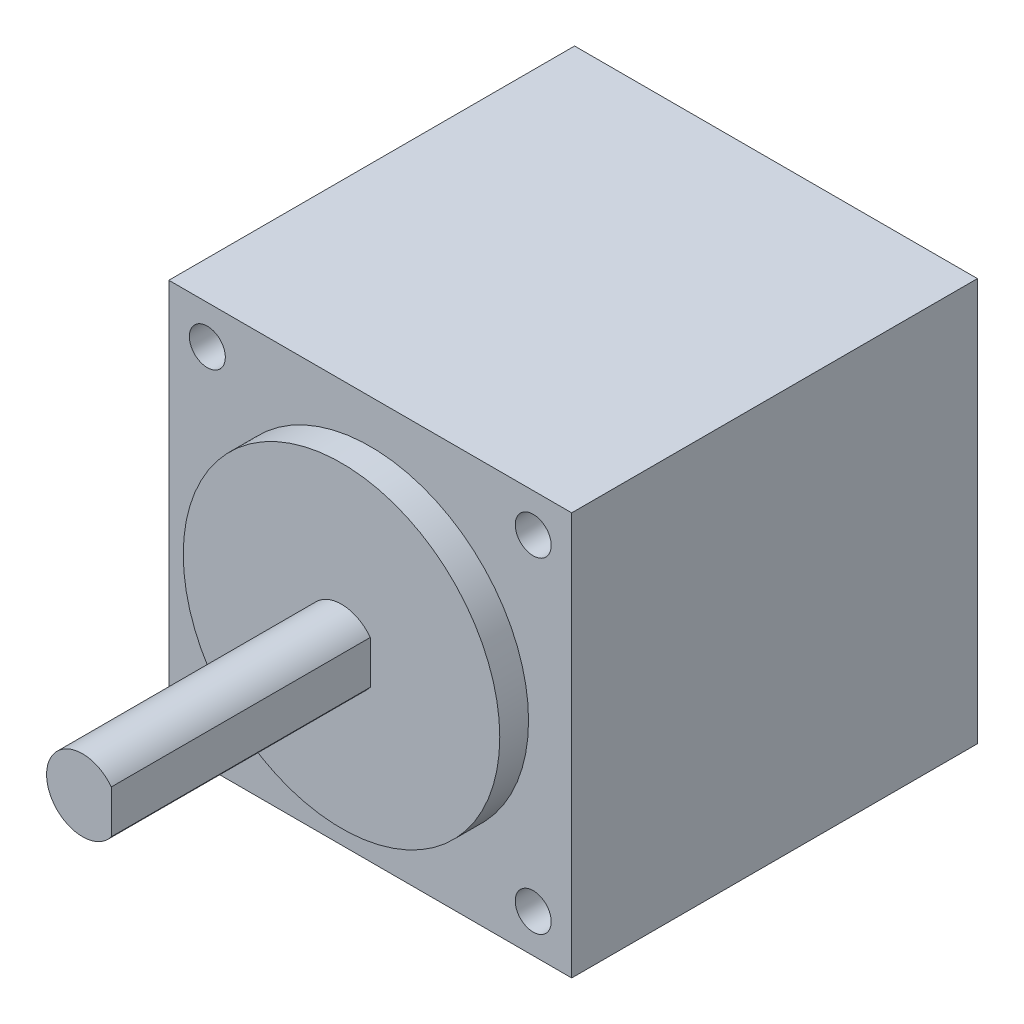
ISO-10303-21;
HEADER;
FILE_DESCRIPTION(('STEP AP214'),'2;1');
FILE_NAME('part.step','',(''),(''),'','','');
FILE_SCHEMA(('AUTOMOTIVE_DESIGN { 1 0 10303 214 1 1 1 1 }'));
ENDSEC;
DATA;
#1=APPLICATION_CONTEXT('core data for automotive mechanical design processes');
#2=APPLICATION_PROTOCOL_DEFINITION('international standard','automotive_design',2000,#1);
#3=PRODUCT_CONTEXT('',#1,'mechanical');
#4=PRODUCT('Part','Part','',(#3));
#5=PRODUCT_RELATED_PRODUCT_CATEGORY('part','',(#4));
#6=PRODUCT_DEFINITION_FORMATION('','',#4);
#7=PRODUCT_DEFINITION_CONTEXT('part definition',#1,'design');
#8=PRODUCT_DEFINITION('design','',#6,#7);
#9=PRODUCT_DEFINITION_SHAPE('','',#8);
#10=(LENGTH_UNIT() NAMED_UNIT(*) SI_UNIT(.MILLI.,.METRE.));
#11=(NAMED_UNIT(*) PLANE_ANGLE_UNIT() SI_UNIT($,.RADIAN.));
#12=(NAMED_UNIT(*) SI_UNIT($,.STERADIAN.) SOLID_ANGLE_UNIT());
#13=UNCERTAINTY_MEASURE_WITH_UNIT(LENGTH_MEASURE(1.E-05),#10,'distance_accuracy_value','');
#14=(GEOMETRIC_REPRESENTATION_CONTEXT(3) GLOBAL_UNCERTAINTY_ASSIGNED_CONTEXT((#13)) GLOBAL_UNIT_ASSIGNED_CONTEXT((#10,
#11,#12)) REPRESENTATION_CONTEXT('',''));
#15=CARTESIAN_POINT('',(0.,0.,0.));
#16=DIRECTION('',(0.,0.,1.));
#17=DIRECTION('',(1.,0.,0.));
#18=AXIS2_PLACEMENT_3D('',#15,#16,#17);
#19=CARTESIAN_POINT('',(14.,-14.,-28.2));
#20=DIRECTION('',(1.,0.,0.));
#21=DIRECTION('',(0.,0.,-1.));
#22=AXIS2_PLACEMENT_3D('',#19,#20,#21);
#23=PLANE('',#22);
#24=DIRECTION('',(0.,1.,0.));
#25=VECTOR('',#24,1.);
#26=CARTESIAN_POINT('',(14.,-14.,0.));
#27=LINE('',#26,#25);
#28=CARTESIAN_POINT('',(14.,-14.,0.));
#29=VERTEX_POINT('',#28);
#30=CARTESIAN_POINT('',(14.,14.,0.));
#31=VERTEX_POINT('',#30);
#32=EDGE_CURVE('E150',#29,#31,#27,.T.);
#33=ORIENTED_EDGE('',*,*,#32,.F.);
#34=DIRECTION('',(0.,0.,1.));
#35=VECTOR('',#34,1.);
#36=CARTESIAN_POINT('',(14.,-14.,-28.2));
#37=LINE('',#36,#35);
#38=CARTESIAN_POINT('',(14.,-14.,-28.2));
#39=VERTEX_POINT('',#38);
#40=EDGE_CURVE('E40',#39,#29,#37,.T.);
#41=ORIENTED_EDGE('',*,*,#40,.F.);
#42=DIRECTION('',(0.,1.,0.));
#43=VECTOR('',#42,1.);
#44=CARTESIAN_POINT('',(14.,-14.,-28.2));
#45=LINE('',#44,#43);
#46=CARTESIAN_POINT('',(14.,14.,-28.2));
#47=VERTEX_POINT('',#46);
#48=EDGE_CURVE('E152',#39,#47,#45,.T.);
#49=ORIENTED_EDGE('',*,*,#48,.T.);
#50=DIRECTION('',(0.,0.,1.));
#51=VECTOR('',#50,1.);
#52=CARTESIAN_POINT('',(14.,14.,-28.2));
#53=LINE('',#52,#51);
#54=EDGE_CURVE('E82',#47,#31,#53,.T.);
#55=ORIENTED_EDGE('',*,*,#54,.T.);
#56=EDGE_LOOP('',(#33,#41,#49,#55));
#57=FACE_BOUND('',#56,.T.);
#58=ADVANCED_FACE('F32',(#57),#23,.T.);
#59=CARTESIAN_POINT('',(-14.,-14.,-28.2));
#60=DIRECTION('',(0.,-1.,0.));
#61=DIRECTION('',(0.,0.,-1.));
#62=AXIS2_PLACEMENT_3D('',#59,#60,#61);
#63=PLANE('',#62);
#64=DIRECTION('',(1.,0.,0.));
#65=VECTOR('',#64,1.);
#66=CARTESIAN_POINT('',(-14.,-14.,0.));
#67=LINE('',#66,#65);
#68=CARTESIAN_POINT('',(-14.,-14.,0.));
#69=VERTEX_POINT('',#68);
#70=EDGE_CURVE('E155',#69,#29,#67,.T.);
#71=ORIENTED_EDGE('',*,*,#70,.F.);
#72=DIRECTION('',(0.,0.,1.));
#73=VECTOR('',#72,1.);
#74=CARTESIAN_POINT('',(-14.,-14.,-28.2));
#75=LINE('',#74,#73);
#76=CARTESIAN_POINT('',(-14.,-14.,-28.2));
#77=VERTEX_POINT('',#76);
#78=EDGE_CURVE('E173',#77,#69,#75,.T.);
#79=ORIENTED_EDGE('',*,*,#78,.F.);
#80=DIRECTION('',(1.,0.,0.));
#81=VECTOR('',#80,1.);
#82=CARTESIAN_POINT('',(-14.,-14.,-28.2));
#83=LINE('',#82,#81);
#84=EDGE_CURVE('E160',#77,#39,#83,.T.);
#85=ORIENTED_EDGE('',*,*,#84,.T.);
#86=ORIENTED_EDGE('',*,*,#40,.T.);
#87=EDGE_LOOP('',(#71,#79,#85,#86));
#88=FACE_BOUND('',#87,.T.);
#89=ADVANCED_FACE('F180',(#88),#63,.T.);
#90=CARTESIAN_POINT('',(-14.,-14.,-28.2));
#91=DIRECTION('',(-1.,0.,0.));
#92=DIRECTION('',(0.,0.,1.));
#93=AXIS2_PLACEMENT_3D('',#90,#91,#92);
#94=PLANE('',#93);
#95=DIRECTION('',(0.,-1.,0.));
#96=VECTOR('',#95,1.);
#97=CARTESIAN_POINT('',(-14.,-14.,0.));
#98=LINE('',#97,#96);
#99=CARTESIAN_POINT('',(-14.,14.,0.));
#100=VERTEX_POINT('',#99);
#101=EDGE_CURVE('E167',#100,#69,#98,.T.);
#102=ORIENTED_EDGE('',*,*,#101,.F.);
#103=DIRECTION('',(0.,0.,1.));
#104=VECTOR('',#103,1.);
#105=CARTESIAN_POINT('',(-14.,14.,-28.2));
#106=LINE('',#105,#104);
#107=CARTESIAN_POINT('',(-14.,14.,-28.2));
#108=VERTEX_POINT('',#107);
#109=EDGE_CURVE('E175',#108,#100,#106,.T.);
#110=ORIENTED_EDGE('',*,*,#109,.F.);
#111=DIRECTION('',(0.,-1.,0.));
#112=VECTOR('',#111,1.);
#113=CARTESIAN_POINT('',(-14.,-14.,-28.2));
#114=LINE('',#113,#112);
#115=EDGE_CURVE('E157',#108,#77,#114,.T.);
#116=ORIENTED_EDGE('',*,*,#115,.T.);
#117=ORIENTED_EDGE('',*,*,#78,.T.);
#118=EDGE_LOOP('',(#102,#110,#116,#117));
#119=FACE_BOUND('',#118,.T.);
#120=ADVANCED_FACE('F184',(#119),#94,.T.);
#121=CARTESIAN_POINT('',(-14.,14.,-28.2));
#122=DIRECTION('',(0.,1.,0.));
#123=DIRECTION('',(0.,0.,1.));
#124=AXIS2_PLACEMENT_3D('',#121,#122,#123);
#125=PLANE('',#124);
#126=DIRECTION('',(-1.,0.,0.));
#127=VECTOR('',#126,1.);
#128=CARTESIAN_POINT('',(-14.,14.,0.));
#129=LINE('',#128,#127);
#130=EDGE_CURVE('E164',#31,#100,#129,.T.);
#131=ORIENTED_EDGE('',*,*,#130,.F.);
#132=ORIENTED_EDGE('',*,*,#54,.F.);
#133=DIRECTION('',(-1.,0.,0.));
#134=VECTOR('',#133,1.);
#135=CARTESIAN_POINT('',(-14.,14.,-28.2));
#136=LINE('',#135,#134);
#137=EDGE_CURVE('E154',#47,#108,#136,.T.);
#138=ORIENTED_EDGE('',*,*,#137,.T.);
#139=ORIENTED_EDGE('',*,*,#109,.T.);
#140=EDGE_LOOP('',(#131,#132,#138,#139));
#141=FACE_BOUND('',#140,.T.);
#142=ADVANCED_FACE('F176',(#141),#125,.T.);
#143=CARTESIAN_POINT('',(0.,0.,-28.2));
#144=DIRECTION('',(0.,0.,-1.));
#145=DIRECTION('',(-1.,0.,0.));
#146=AXIS2_PLACEMENT_3D('',#143,#144,#145);
#147=PLANE('',#146);
#148=ORIENTED_EDGE('',*,*,#48,.F.);
#149=ORIENTED_EDGE('',*,*,#84,.F.);
#150=ORIENTED_EDGE('',*,*,#115,.F.);
#151=ORIENTED_EDGE('',*,*,#137,.F.);
#152=EDGE_LOOP('',(#148,#149,#150,#151));
#153=FACE_BOUND('',#152,.T.);
#154=ADVANCED_FACE('F186',(#153),#147,.T.);
#155=CARTESIAN_POINT('',(0.,0.,0.));
#156=DIRECTION('',(0.,0.,-1.));
#157=DIRECTION('',(-1.,0.,0.));
#158=AXIS2_PLACEMENT_3D('',#155,#156,#157);
#159=PLANE('',#158);
#160=CARTESIAN_POINT('',(-11.325,11.325,0.));
#161=DIRECTION('',(0.,0.,1.));
#162=DIRECTION('',(1.,0.,0.));
#163=AXIS2_PLACEMENT_3D('',#160,#161,#162);
#164=CIRCLE('',#163,1.25);
#165=CARTESIAN_POINT('',(-10.075,11.325,0.));
#166=VERTEX_POINT('',#165);
#167=EDGE_CURVE('E115',#166,#166,#164,.T.);
#168=ORIENTED_EDGE('',*,*,#167,.F.);
#169=EDGE_LOOP('',(#168));
#170=FACE_BOUND('',#169,.T.);
#171=CARTESIAN_POINT('',(11.325,11.325,0.));
#172=DIRECTION('',(0.,0.,1.));
#173=DIRECTION('',(1.,0.,0.));
#174=AXIS2_PLACEMENT_3D('',#171,#172,#173);
#175=CIRCLE('',#174,1.25);
#176=CARTESIAN_POINT('',(12.575,11.325,0.));
#177=VERTEX_POINT('',#176);
#178=EDGE_CURVE('E114',#177,#177,#175,.T.);
#179=ORIENTED_EDGE('',*,*,#178,.F.);
#180=EDGE_LOOP('',(#179));
#181=FACE_BOUND('',#180,.T.);
#182=CARTESIAN_POINT('',(11.325,-11.325,0.));
#183=DIRECTION('',(0.,0.,1.));
#184=DIRECTION('',(1.,0.,0.));
#185=AXIS2_PLACEMENT_3D('',#182,#183,#184);
#186=CIRCLE('',#185,1.25);
#187=CARTESIAN_POINT('',(12.575,-11.325,0.));
#188=VERTEX_POINT('',#187);
#189=EDGE_CURVE('E125',#188,#188,#186,.T.);
#190=ORIENTED_EDGE('',*,*,#189,.F.);
#191=EDGE_LOOP('',(#190));
#192=FACE_BOUND('',#191,.T.);
#193=CARTESIAN_POINT('',(-11.325,-11.325,0.));
#194=DIRECTION('',(0.,0.,1.));
#195=DIRECTION('',(1.,0.,0.));
#196=AXIS2_PLACEMENT_3D('',#193,#194,#195);
#197=CIRCLE('',#196,1.25);
#198=CARTESIAN_POINT('',(-10.075,-11.325,0.));
#199=VERTEX_POINT('',#198);
#200=EDGE_CURVE('E131',#199,#199,#197,.T.);
#201=ORIENTED_EDGE('',*,*,#200,.F.);
#202=EDGE_LOOP('',(#201));
#203=FACE_BOUND('',#202,.T.);
#204=CARTESIAN_POINT('',(0.,0.,0.));
#205=DIRECTION('',(0.,0.,1.));
#206=DIRECTION('',(1.,0.,0.));
#207=AXIS2_PLACEMENT_3D('',#204,#205,#206);
#208=CIRCLE('',#207,11.);
#209=CARTESIAN_POINT('',(11.,0.,0.));
#210=VERTEX_POINT('',#209);
#211=EDGE_CURVE('E11',#210,#210,#208,.T.);
#212=ORIENTED_EDGE('',*,*,#211,.F.);
#213=EDGE_LOOP('',(#212));
#214=FACE_BOUND('',#213,.T.);
#215=ORIENTED_EDGE('',*,*,#32,.T.);
#216=ORIENTED_EDGE('',*,*,#130,.T.);
#217=ORIENTED_EDGE('',*,*,#101,.T.);
#218=ORIENTED_EDGE('',*,*,#70,.T.);
#219=EDGE_LOOP('',(#215,#216,#217,#218));
#220=FACE_BOUND('',#219,.T.);
#221=ADVANCED_FACE('F179',(#170,#181,#192,#203,#214,#220),#159,.F.);
#222=CARTESIAN_POINT('',(0.,0.,2.));
#223=DIRECTION('',(0.,0.,-1.));
#224=DIRECTION('',(-1.,0.,0.));
#225=AXIS2_PLACEMENT_3D('',#222,#223,#224);
#226=CYLINDRICAL_SURFACE('',#225,11.);
#227=CARTESIAN_POINT('',(0.,0.,2.));
#228=DIRECTION('',(0.,0.,1.));
#229=DIRECTION('',(1.,0.,0.));
#230=AXIS2_PLACEMENT_3D('',#227,#228,#229);
#231=CIRCLE('',#230,11.);
#232=CARTESIAN_POINT('',(11.,0.,2.));
#233=VERTEX_POINT('',#232);
#234=EDGE_CURVE('E148',#233,#233,#231,.T.);
#235=ORIENTED_EDGE('',*,*,#234,.F.);
#236=EDGE_LOOP('',(#235));
#237=FACE_BOUND('',#236,.T.);
#238=ORIENTED_EDGE('',*,*,#211,.T.);
#239=EDGE_LOOP('',(#238));
#240=FACE_BOUND('',#239,.T.);
#241=ADVANCED_FACE('F193',(#237,#240),#226,.T.);
#242=CARTESIAN_POINT('',(0.,0.,2.));
#243=DIRECTION('',(0.,0.,1.));
#244=DIRECTION('',(1.,0.,0.));
#245=AXIS2_PLACEMENT_3D('',#242,#243,#244);
#246=PLANE('',#245);
#247=CARTESIAN_POINT('',(0.,0.,2.));
#248=DIRECTION('',(0.,0.,1.));
#249=DIRECTION('',(1.,0.,0.));
#250=AXIS2_PLACEMENT_3D('',#247,#248,#249);
#251=CIRCLE('',#250,2.5);
#252=CARTESIAN_POINT('',(2.,-1.5,2.));
#253=VERTEX_POINT('',#252);
#254=CARTESIAN_POINT('',(2.,1.5,2.));
#255=VERTEX_POINT('',#254);
#256=EDGE_CURVE('E35',#253,#255,#251,.F.);
#257=ORIENTED_EDGE('',*,*,#256,.T.);
#258=DIRECTION('',(0.,1.,0.));
#259=VECTOR('',#258,1.);
#260=CARTESIAN_POINT('',(2.,0.,2.));
#261=LINE('',#260,#259);
#262=EDGE_CURVE('E142',#253,#255,#261,.T.);
#263=ORIENTED_EDGE('',*,*,#262,.F.);
#264=EDGE_LOOP('',(#257,#263));
#265=FACE_BOUND('',#264,.T.);
#266=ORIENTED_EDGE('',*,*,#234,.T.);
#267=EDGE_LOOP('',(#266));
#268=FACE_BOUND('',#267,.T.);
#269=ADVANCED_FACE('F226',(#265,#268),#246,.T.);
#270=CARTESIAN_POINT('',(0.,0.,20.));
#271=DIRECTION('',(0.,0.,-1.));
#272=DIRECTION('',(-1.,0.,0.));
#273=AXIS2_PLACEMENT_3D('',#270,#271,#272);
#274=CYLINDRICAL_SURFACE('',#273,2.5);
#275=CARTESIAN_POINT('',(0.,0.,20.));
#276=DIRECTION('',(0.,0.,1.));
#277=DIRECTION('',(1.,0.,0.));
#278=AXIS2_PLACEMENT_3D('',#275,#276,#277);
#279=CIRCLE('',#278,2.5);
#280=CARTESIAN_POINT('',(2.,1.5,20.));
#281=VERTEX_POINT('',#280);
#282=CARTESIAN_POINT('',(2.,-1.5,20.));
#283=VERTEX_POINT('',#282);
#284=EDGE_CURVE('E145',#281,#283,#279,.T.);
#285=ORIENTED_EDGE('',*,*,#284,.F.);
#286=DIRECTION('',(0.,0.,1.));
#287=VECTOR('',#286,1.);
#288=CARTESIAN_POINT('',(2.,1.5,-1.04138126514911));
#289=LINE('',#288,#287);
#290=EDGE_CURVE('E48',#255,#281,#289,.T.);
#291=ORIENTED_EDGE('',*,*,#290,.F.);
#292=ORIENTED_EDGE('',*,*,#256,.F.);
#293=DIRECTION('',(0.,0.,1.));
#294=VECTOR('',#293,1.);
#295=CARTESIAN_POINT('',(2.,-1.5,-1.04138126514911));
#296=LINE('',#295,#294);
#297=EDGE_CURVE('E139',#253,#283,#296,.T.);
#298=ORIENTED_EDGE('',*,*,#297,.T.);
#299=EDGE_LOOP('',(#285,#291,#292,#298));
#300=FACE_BOUND('',#299,.T.);
#301=ADVANCED_FACE('F236',(#300),#274,.T.);
#302=CARTESIAN_POINT('',(0.,0.,20.));
#303=DIRECTION('',(0.,0.,1.));
#304=DIRECTION('',(1.,0.,0.));
#305=AXIS2_PLACEMENT_3D('',#302,#303,#304);
#306=PLANE('',#305);
#307=DIRECTION('',(0.,-1.,0.));
#308=VECTOR('',#307,1.);
#309=CARTESIAN_POINT('',(2.,0.,20.));
#310=LINE('',#309,#308);
#311=EDGE_CURVE('E137',#281,#283,#310,.T.);
#312=ORIENTED_EDGE('',*,*,#311,.F.);
#313=ORIENTED_EDGE('',*,*,#284,.T.);
#314=EDGE_LOOP('',(#312,#313));
#315=FACE_BOUND('',#314,.T.);
#316=ADVANCED_FACE('F248',(#315),#306,.T.);
#317=CARTESIAN_POINT('',(2.,0.,-1.04138126514911));
#318=DIRECTION('',(-1.,0.,0.));
#319=DIRECTION('',(0.,0.,1.));
#320=AXIS2_PLACEMENT_3D('',#317,#318,#319);
#321=PLANE('',#320);
#322=ORIENTED_EDGE('',*,*,#262,.T.);
#323=ORIENTED_EDGE('',*,*,#290,.T.);
#324=ORIENTED_EDGE('',*,*,#311,.T.);
#325=ORIENTED_EDGE('',*,*,#297,.F.);
#326=EDGE_LOOP('',(#322,#323,#324,#325));
#327=FACE_BOUND('',#326,.T.);
#328=ADVANCED_FACE('F257',(#327),#321,.F.);
#329=CARTESIAN_POINT('',(-11.325,-11.325,-4.));
#330=DIRECTION('',(0.,0.,1.));
#331=DIRECTION('',(1.,0.,0.));
#332=AXIS2_PLACEMENT_3D('',#329,#330,#331);
#333=CONICAL_SURFACE('',#332,1.25,1.02974425867665);
#334=CARTESIAN_POINT('',(-11.325,-11.325,-4.75107577378445));
#335=VERTEX_POINT('',#334);
#336=VERTEX_LOOP('',#335);
#337=FACE_BOUND('',#336,.T.);
#338=CARTESIAN_POINT('',(-11.325,-11.325,-4.));
#339=DIRECTION('',(0.,0.,1.));
#340=DIRECTION('',(1.,0.,0.));
#341=AXIS2_PLACEMENT_3D('',#338,#339,#340);
#342=CIRCLE('',#341,1.25);
#343=CARTESIAN_POINT('',(-10.075,-11.325,-4.));
#344=VERTEX_POINT('',#343);
#345=EDGE_CURVE('E134',#344,#344,#342,.T.);
#346=ORIENTED_EDGE('',*,*,#345,.T.);
#347=EDGE_LOOP('',(#346));
#348=FACE_BOUND('',#347,.T.);
#349=ADVANCED_FACE('F266',(#337,#348),#333,.F.);
#350=CARTESIAN_POINT('',(-11.325,-11.325,0.));
#351=DIRECTION('',(0.,0.,1.));
#352=DIRECTION('',(1.,0.,0.));
#353=AXIS2_PLACEMENT_3D('',#350,#351,#352);
#354=CYLINDRICAL_SURFACE('',#353,1.25);
#355=ORIENTED_EDGE('',*,*,#345,.F.);
#356=EDGE_LOOP('',(#355));
#357=FACE_BOUND('',#356,.T.);
#358=ORIENTED_EDGE('',*,*,#200,.T.);
#359=EDGE_LOOP('',(#358));
#360=FACE_BOUND('',#359,.T.);
#361=ADVANCED_FACE('F280',(#357,#360),#354,.F.);
#362=CARTESIAN_POINT('',(11.325,-11.325,-4.));
#363=DIRECTION('',(0.,0.,1.));
#364=DIRECTION('',(1.,0.,0.));
#365=AXIS2_PLACEMENT_3D('',#362,#363,#364);
#366=CONICAL_SURFACE('',#365,1.25,1.02974425867665);
#367=CARTESIAN_POINT('',(11.325,-11.325,-4.75107577378445));
#368=VERTEX_POINT('',#367);
#369=VERTEX_LOOP('',#368);
#370=FACE_BOUND('',#369,.T.);
#371=CARTESIAN_POINT('',(11.325,-11.325,-4.));
#372=DIRECTION('',(0.,0.,1.));
#373=DIRECTION('',(1.,0.,0.));
#374=AXIS2_PLACEMENT_3D('',#371,#372,#373);
#375=CIRCLE('',#374,1.25);
#376=CARTESIAN_POINT('',(12.575,-11.325,-4.));
#377=VERTEX_POINT('',#376);
#378=EDGE_CURVE('E128',#377,#377,#375,.T.);
#379=ORIENTED_EDGE('',*,*,#378,.T.);
#380=EDGE_LOOP('',(#379));
#381=FACE_BOUND('',#380,.T.);
#382=ADVANCED_FACE('F290',(#370,#381),#366,.F.);
#383=CARTESIAN_POINT('',(11.325,-11.325,0.));
#384=DIRECTION('',(0.,0.,1.));
#385=DIRECTION('',(1.,0.,0.));
#386=AXIS2_PLACEMENT_3D('',#383,#384,#385);
#387=CYLINDRICAL_SURFACE('',#386,1.25);
#388=ORIENTED_EDGE('',*,*,#378,.F.);
#389=EDGE_LOOP('',(#388));
#390=FACE_BOUND('',#389,.T.);
#391=ORIENTED_EDGE('',*,*,#189,.T.);
#392=EDGE_LOOP('',(#391));
#393=FACE_BOUND('',#392,.T.);
#394=ADVANCED_FACE('F300',(#390,#393),#387,.F.);
#395=CARTESIAN_POINT('',(11.325,11.325,-4.));
#396=DIRECTION('',(0.,0.,1.));
#397=DIRECTION('',(1.,0.,0.));
#398=AXIS2_PLACEMENT_3D('',#395,#396,#397);
#399=CONICAL_SURFACE('',#398,1.25,1.02974425867665);
#400=CARTESIAN_POINT('',(11.325,11.325,-4.75107577378445));
#401=VERTEX_POINT('',#400);
#402=VERTEX_LOOP('',#401);
#403=FACE_BOUND('',#402,.T.);
#404=CARTESIAN_POINT('',(11.325,11.325,-4.));
#405=DIRECTION('',(0.,0.,1.));
#406=DIRECTION('',(1.,0.,0.));
#407=AXIS2_PLACEMENT_3D('',#404,#405,#406);
#408=CIRCLE('',#407,1.25);
#409=CARTESIAN_POINT('',(12.575,11.325,-4.));
#410=VERTEX_POINT('',#409);
#411=EDGE_CURVE('E118',#410,#410,#408,.T.);
#412=ORIENTED_EDGE('',*,*,#411,.T.);
#413=EDGE_LOOP('',(#412));
#414=FACE_BOUND('',#413,.T.);
#415=ADVANCED_FACE('F310',(#403,#414),#399,.F.);
#416=CARTESIAN_POINT('',(11.325,11.325,0.));
#417=DIRECTION('',(0.,0.,1.));
#418=DIRECTION('',(1.,0.,0.));
#419=AXIS2_PLACEMENT_3D('',#416,#417,#418);
#420=CYLINDRICAL_SURFACE('',#419,1.25);
#421=ORIENTED_EDGE('',*,*,#411,.F.);
#422=EDGE_LOOP('',(#421));
#423=FACE_BOUND('',#422,.T.);
#424=ORIENTED_EDGE('',*,*,#178,.T.);
#425=EDGE_LOOP('',(#424));
#426=FACE_BOUND('',#425,.T.);
#427=ADVANCED_FACE('F108',(#423,#426),#420,.F.);
#428=CARTESIAN_POINT('',(-11.325,11.325,-4.));
#429=DIRECTION('',(0.,0.,1.));
#430=DIRECTION('',(1.,0.,0.));
#431=AXIS2_PLACEMENT_3D('',#428,#429,#430);
#432=CONICAL_SURFACE('',#431,1.25,1.02974425867665);
#433=CARTESIAN_POINT('',(-11.325,11.325,-4.75107577378445));
#434=VERTEX_POINT('',#433);
#435=VERTEX_LOOP('',#434);
#436=FACE_BOUND('',#435,.T.);
#437=CARTESIAN_POINT('',(-11.325,11.325,-4.));
#438=DIRECTION('',(0.,0.,1.));
#439=DIRECTION('',(1.,0.,0.));
#440=AXIS2_PLACEMENT_3D('',#437,#438,#439);
#441=CIRCLE('',#440,1.25);
#442=CARTESIAN_POINT('',(-10.075,11.325,-4.));
#443=VERTEX_POINT('',#442);
#444=EDGE_CURVE('E112',#443,#443,#441,.T.);
#445=ORIENTED_EDGE('',*,*,#444,.T.);
#446=EDGE_LOOP('',(#445));
#447=FACE_BOUND('',#446,.T.);
#448=ADVANCED_FACE('F104',(#436,#447),#432,.F.);
#449=CARTESIAN_POINT('',(-11.325,11.325,0.));
#450=DIRECTION('',(0.,0.,1.));
#451=DIRECTION('',(1.,0.,0.));
#452=AXIS2_PLACEMENT_3D('',#449,#450,#451);
#453=CYLINDRICAL_SURFACE('',#452,1.25);
#454=ORIENTED_EDGE('',*,*,#444,.F.);
#455=EDGE_LOOP('',(#454));
#456=FACE_BOUND('',#455,.T.);
#457=ORIENTED_EDGE('',*,*,#167,.T.);
#458=EDGE_LOOP('',(#457));
#459=FACE_BOUND('',#458,.T.);
#460=ADVANCED_FACE('F107',(#456,#459),#453,.F.);
#461=CLOSED_SHELL('',(#58,#89,#120,#142,#154,#221,#241,#269,#301,#316,#328,#349,#361,#382,#394,
#415,#427,#448,#460));
#462=MANIFOLD_SOLID_BREP('B2',#461);
#463=ADVANCED_BREP_SHAPE_REPRESENTATION('',(#18,#462),#14);
#464=SHAPE_DEFINITION_REPRESENTATION(#9,#463);
ENDSEC;
END-ISO-10303-21;
